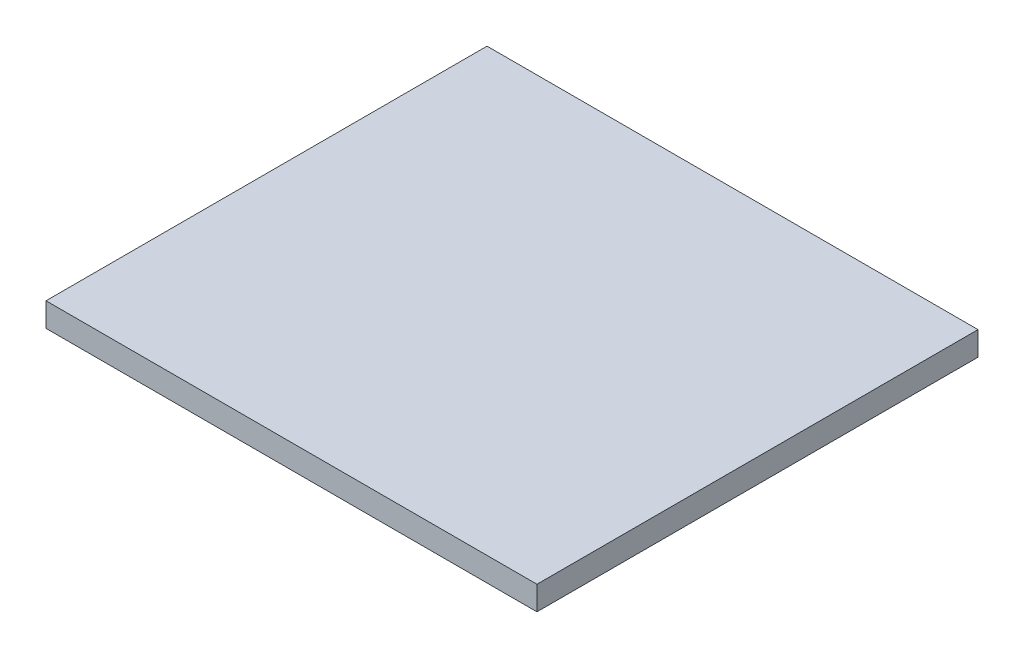
ISO-10303-21;
HEADER;
FILE_DESCRIPTION(('STEP AP214'),'2;1');
FILE_NAME('part.step','',(''),(''),'','','');
FILE_SCHEMA(('AUTOMOTIVE_DESIGN { 1 0 10303 214 1 1 1 1 }'));
ENDSEC;
DATA;
#1=APPLICATION_CONTEXT('core data for automotive mechanical design processes');
#2=APPLICATION_PROTOCOL_DEFINITION('international standard','automotive_design',2000,#1);
#3=PRODUCT_CONTEXT('',#1,'mechanical');
#4=PRODUCT('Part','Part','',(#3));
#5=PRODUCT_RELATED_PRODUCT_CATEGORY('part','',(#4));
#6=PRODUCT_DEFINITION_FORMATION('','',#4);
#7=PRODUCT_DEFINITION_CONTEXT('part definition',#1,'design');
#8=PRODUCT_DEFINITION('design','',#6,#7);
#9=PRODUCT_DEFINITION_SHAPE('','',#8);
#10=(LENGTH_UNIT() NAMED_UNIT(*) SI_UNIT(.MILLI.,.METRE.));
#11=(NAMED_UNIT(*) PLANE_ANGLE_UNIT() SI_UNIT($,.RADIAN.));
#12=(NAMED_UNIT(*) SI_UNIT($,.STERADIAN.) SOLID_ANGLE_UNIT());
#13=UNCERTAINTY_MEASURE_WITH_UNIT(LENGTH_MEASURE(1.E-05),#10,'distance_accuracy_value','');
#14=(GEOMETRIC_REPRESENTATION_CONTEXT(3) GLOBAL_UNCERTAINTY_ASSIGNED_CONTEXT((#13)) GLOBAL_UNIT_ASSIGNED_CONTEXT((#10,
#11,#12)) REPRESENTATION_CONTEXT('',''));
#15=CARTESIAN_POINT('',(0.,0.,0.));
#16=DIRECTION('',(0.,0.,1.));
#17=DIRECTION('',(1.,0.,0.));
#18=AXIS2_PLACEMENT_3D('',#15,#16,#17);
#19=CARTESIAN_POINT('',(-187.325,18.25625,-336.55));
#20=DIRECTION('',(1.,0.,0.));
#21=DIRECTION('',(0.,0.,-1.));
#22=AXIS2_PLACEMENT_3D('',#19,#20,#21);
#23=PLANE('',#22);
#24=DIRECTION('',(0.,0.,1.));
#25=VECTOR('',#24,1.);
#26=CARTESIAN_POINT('',(-187.325,0.,-336.55));
#27=LINE('',#26,#25);
#28=CARTESIAN_POINT('',(-187.325,0.,-336.55));
#29=VERTEX_POINT('',#28);
#30=CARTESIAN_POINT('',(-187.325,0.,0.));
#31=VERTEX_POINT('',#30);
#32=EDGE_CURVE('E96',#29,#31,#27,.T.);
#33=ORIENTED_EDGE('',*,*,#32,.T.);
#34=DIRECTION('',(0.,-1.,0.));
#35=VECTOR('',#34,1.);
#36=CARTESIAN_POINT('',(-187.325,18.25625,0.));
#37=LINE('',#36,#35);
#38=CARTESIAN_POINT('',(-187.325,18.25625,0.));
#39=VERTEX_POINT('',#38);
#40=EDGE_CURVE('E11',#39,#31,#37,.T.);
#41=ORIENTED_EDGE('',*,*,#40,.F.);
#42=DIRECTION('',(0.,0.,1.));
#43=VECTOR('',#42,1.);
#44=CARTESIAN_POINT('',(-187.325,18.25625,-336.55));
#45=LINE('',#44,#43);
#46=CARTESIAN_POINT('',(-187.325,18.25625,-336.55));
#47=VERTEX_POINT('',#46);
#48=EDGE_CURVE('E84',#47,#39,#45,.T.);
#49=ORIENTED_EDGE('',*,*,#48,.F.);
#50=DIRECTION('',(0.,-1.,0.));
#51=VECTOR('',#50,1.);
#52=CARTESIAN_POINT('',(-187.325,18.25625,-336.55));
#53=LINE('',#52,#51);
#54=EDGE_CURVE('E92',#47,#29,#53,.T.);
#55=ORIENTED_EDGE('',*,*,#54,.T.);
#56=EDGE_LOOP('',(#33,#41,#49,#55));
#57=FACE_BOUND('',#56,.T.);
#58=ADVANCED_FACE('F33',(#57),#23,.F.);
#59=CARTESIAN_POINT('',(-187.325,18.25625,0.));
#60=DIRECTION('',(0.,0.,-1.));
#61=DIRECTION('',(-1.,0.,0.));
#62=AXIS2_PLACEMENT_3D('',#59,#60,#61);
#63=PLANE('',#62);
#64=DIRECTION('',(1.,0.,0.));
#65=VECTOR('',#64,1.);
#66=CARTESIAN_POINT('',(-187.325,0.,0.));
#67=LINE('',#66,#65);
#68=CARTESIAN_POINT('',(187.325,0.,0.));
#69=VERTEX_POINT('',#68);
#70=EDGE_CURVE('E88',#31,#69,#67,.T.);
#71=ORIENTED_EDGE('',*,*,#70,.T.);
#72=DIRECTION('',(0.,-1.,0.));
#73=VECTOR('',#72,1.);
#74=CARTESIAN_POINT('',(187.325,18.25625,0.));
#75=LINE('',#74,#73);
#76=CARTESIAN_POINT('',(187.325,18.25625,0.));
#77=VERTEX_POINT('',#76);
#78=EDGE_CURVE('E41',#77,#69,#75,.T.);
#79=ORIENTED_EDGE('',*,*,#78,.F.);
#80=DIRECTION('',(1.,0.,0.));
#81=VECTOR('',#80,1.);
#82=CARTESIAN_POINT('',(-187.325,18.25625,0.));
#83=LINE('',#82,#81);
#84=EDGE_CURVE('E79',#39,#77,#83,.T.);
#85=ORIENTED_EDGE('',*,*,#84,.F.);
#86=ORIENTED_EDGE('',*,*,#40,.T.);
#87=EDGE_LOOP('',(#71,#79,#85,#86));
#88=FACE_BOUND('',#87,.T.);
#89=ADVANCED_FACE('F87',(#88),#63,.F.);
#90=CARTESIAN_POINT('',(187.325,18.25625,-336.55));
#91=DIRECTION('',(-1.,0.,0.));
#92=DIRECTION('',(0.,0.,1.));
#93=AXIS2_PLACEMENT_3D('',#90,#91,#92);
#94=PLANE('',#93);
#95=DIRECTION('',(0.,0.,-1.));
#96=VECTOR('',#95,1.);
#97=CARTESIAN_POINT('',(187.325,0.,-336.55));
#98=LINE('',#97,#96);
#99=CARTESIAN_POINT('',(187.325,0.,-336.55));
#100=VERTEX_POINT('',#99);
#101=EDGE_CURVE('E66',#69,#100,#98,.T.);
#102=ORIENTED_EDGE('',*,*,#101,.T.);
#103=DIRECTION('',(0.,-1.,0.));
#104=VECTOR('',#103,1.);
#105=CARTESIAN_POINT('',(187.325,18.25625,-336.55));
#106=LINE('',#105,#104);
#107=CARTESIAN_POINT('',(187.325,18.25625,-336.55));
#108=VERTEX_POINT('',#107);
#109=EDGE_CURVE('E89',#108,#100,#106,.T.);
#110=ORIENTED_EDGE('',*,*,#109,.F.);
#111=DIRECTION('',(0.,0.,-1.));
#112=VECTOR('',#111,1.);
#113=CARTESIAN_POINT('',(187.325,18.25625,-336.55));
#114=LINE('',#113,#112);
#115=EDGE_CURVE('E82',#77,#108,#114,.T.);
#116=ORIENTED_EDGE('',*,*,#115,.F.);
#117=ORIENTED_EDGE('',*,*,#78,.T.);
#118=EDGE_LOOP('',(#102,#110,#116,#117));
#119=FACE_BOUND('',#118,.T.);
#120=ADVANCED_FACE('F90',(#119),#94,.F.);
#121=CARTESIAN_POINT('',(-187.325,18.25625,-336.55));
#122=DIRECTION('',(0.,0.,1.));
#123=DIRECTION('',(1.,0.,0.));
#124=AXIS2_PLACEMENT_3D('',#121,#122,#123);
#125=PLANE('',#124);
#126=DIRECTION('',(-1.,0.,0.));
#127=VECTOR('',#126,1.);
#128=CARTESIAN_POINT('',(-187.325,0.,-336.55));
#129=LINE('',#128,#127);
#130=EDGE_CURVE('E72',#100,#29,#129,.T.);
#131=ORIENTED_EDGE('',*,*,#130,.T.);
#132=ORIENTED_EDGE('',*,*,#54,.F.);
#133=DIRECTION('',(-1.,0.,0.));
#134=VECTOR('',#133,1.);
#135=CARTESIAN_POINT('',(-187.325,18.25625,-336.55));
#136=LINE('',#135,#134);
#137=EDGE_CURVE('E49',#108,#47,#136,.T.);
#138=ORIENTED_EDGE('',*,*,#137,.F.);
#139=ORIENTED_EDGE('',*,*,#109,.T.);
#140=EDGE_LOOP('',(#131,#132,#138,#139));
#141=FACE_BOUND('',#140,.T.);
#142=ADVANCED_FACE('F103',(#141),#125,.F.);
#143=CARTESIAN_POINT('',(0.,18.25625,0.));
#144=DIRECTION('',(0.,1.,0.));
#145=DIRECTION('',(0.,0.,1.));
#146=AXIS2_PLACEMENT_3D('',#143,#144,#145);
#147=PLANE('',#146);
#148=ORIENTED_EDGE('',*,*,#48,.T.);
#149=ORIENTED_EDGE('',*,*,#84,.T.);
#150=ORIENTED_EDGE('',*,*,#115,.T.);
#151=ORIENTED_EDGE('',*,*,#137,.T.);
#152=EDGE_LOOP('',(#148,#149,#150,#151));
#153=FACE_BOUND('',#152,.T.);
#154=ADVANCED_FACE('F80',(#153),#147,.T.);
#155=CARTESIAN_POINT('',(0.,0.,0.));
#156=DIRECTION('',(0.,1.,0.));
#157=DIRECTION('',(0.,0.,1.));
#158=AXIS2_PLACEMENT_3D('',#155,#156,#157);
#159=PLANE('',#158);
#160=ORIENTED_EDGE('',*,*,#32,.F.);
#161=ORIENTED_EDGE('',*,*,#130,.F.);
#162=ORIENTED_EDGE('',*,*,#101,.F.);
#163=ORIENTED_EDGE('',*,*,#70,.F.);
#164=EDGE_LOOP('',(#160,#161,#162,#163));
#165=FACE_BOUND('',#164,.T.);
#166=ADVANCED_FACE('F106',(#165),#159,.F.);
#167=CLOSED_SHELL('',(#58,#89,#120,#142,#154,#166));
#168=MANIFOLD_SOLID_BREP('B2',#167);
#169=ADVANCED_BREP_SHAPE_REPRESENTATION('',(#18,#168),#14);
#170=SHAPE_DEFINITION_REPRESENTATION(#9,#169);
ENDSEC;
END-ISO-10303-21;
